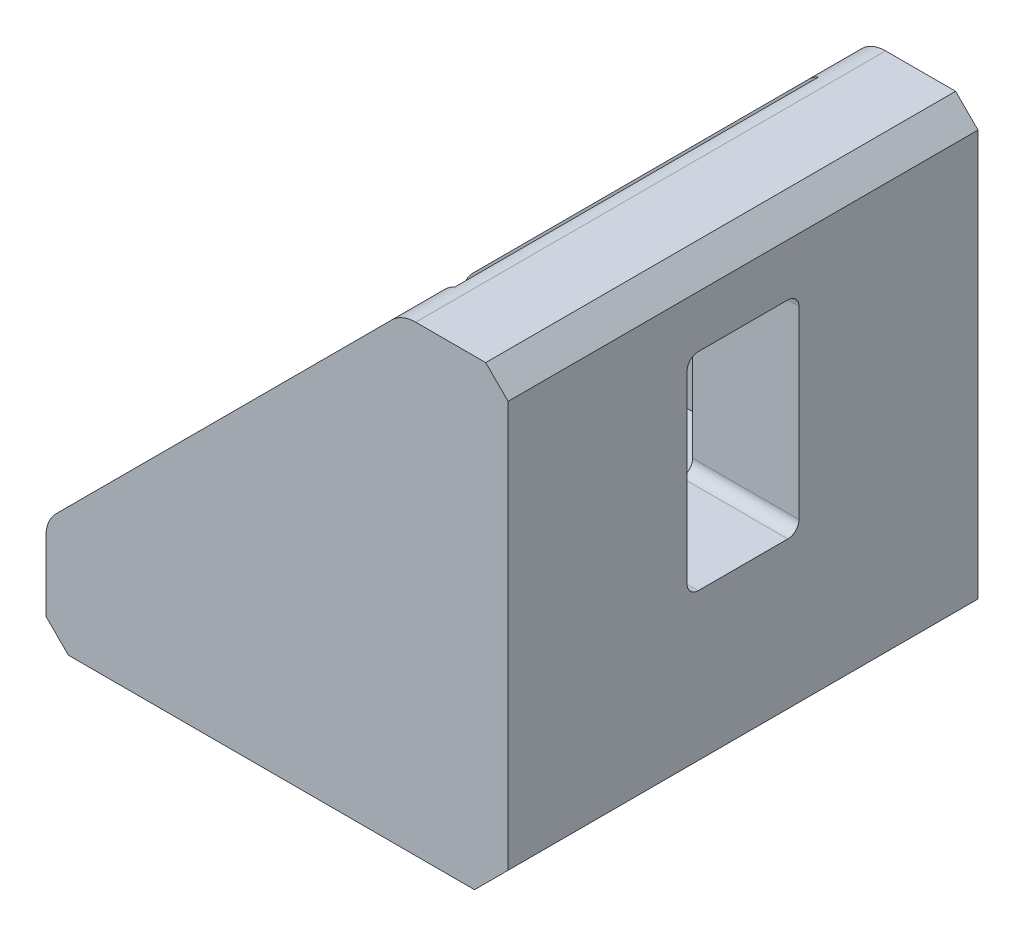
ISO-10303-21;
HEADER;
FILE_DESCRIPTION(('STEP AP214'),'2;1');
FILE_NAME('part.step','',(''),(''),'','','');
FILE_SCHEMA(('AUTOMOTIVE_DESIGN { 1 0 10303 214 1 1 1 1 }'));
ENDSEC;
DATA;
#1=APPLICATION_CONTEXT('core data for automotive mechanical design processes');
#2=APPLICATION_PROTOCOL_DEFINITION('international standard','automotive_design',2000,#1);
#3=PRODUCT_CONTEXT('',#1,'mechanical');
#4=PRODUCT('Part','Part','',(#3));
#5=PRODUCT_RELATED_PRODUCT_CATEGORY('part','',(#4));
#6=PRODUCT_DEFINITION_FORMATION('','',#4);
#7=PRODUCT_DEFINITION_CONTEXT('part definition',#1,'design');
#8=PRODUCT_DEFINITION('design','',#6,#7);
#9=PRODUCT_DEFINITION_SHAPE('','',#8);
#10=(LENGTH_UNIT() NAMED_UNIT(*) SI_UNIT(.MILLI.,.METRE.));
#11=(NAMED_UNIT(*) PLANE_ANGLE_UNIT() SI_UNIT($,.RADIAN.));
#12=(NAMED_UNIT(*) SI_UNIT($,.STERADIAN.) SOLID_ANGLE_UNIT());
#13=UNCERTAINTY_MEASURE_WITH_UNIT(LENGTH_MEASURE(1.E-05),#10,'distance_accuracy_value','');
#14=(GEOMETRIC_REPRESENTATION_CONTEXT(3) GLOBAL_UNCERTAINTY_ASSIGNED_CONTEXT((#13)) GLOBAL_UNIT_ASSIGNED_CONTEXT((#10,
#11,#12)) REPRESENTATION_CONTEXT('',''));
#15=CARTESIAN_POINT('',(0.,0.,0.));
#16=DIRECTION('',(0.,0.,1.));
#17=DIRECTION('',(1.,0.,0.));
#18=AXIS2_PLACEMENT_3D('',#15,#16,#17);
#19=CARTESIAN_POINT('',(-38.3,8.25735931288071,42.));
#20=DIRECTION('',(0.,0.,1.));
#21=DIRECTION('',(1.,0.,0.));
#22=AXIS2_PLACEMENT_3D('',#19,#20,#21);
#23=CYLINDRICAL_SURFACE('',#22,3.);
#24=DIRECTION('',(0.,0.,-1.));
#25=VECTOR('',#24,1.);
#26=CARTESIAN_POINT('',(-41.3,8.25735931288071,42.));
#27=LINE('',#26,#25);
#28=CARTESIAN_POINT('',(-41.3,8.25735931288071,42.));
#29=VERTEX_POINT('',#28);
#30=CARTESIAN_POINT('',(-41.3,8.25735931288071,0.));
#31=VERTEX_POINT('',#30);
#32=EDGE_CURVE('E441',#29,#31,#27,.T.);
#33=ORIENTED_EDGE('',*,*,#32,.F.);
#34=CARTESIAN_POINT('',(-38.3,8.25735931288071,42.));
#35=DIRECTION('',(0.,0.,1.));
#36=DIRECTION('',(1.,0.,0.));
#37=AXIS2_PLACEMENT_3D('',#34,#35,#36);
#38=CIRCLE('',#37,3.);
#39=CARTESIAN_POINT('',(-40.4213203435596,10.3786796564403,42.));
#40=VERTEX_POINT('',#39);
#41=EDGE_CURVE('E462',#40,#29,#38,.T.);
#42=ORIENTED_EDGE('',*,*,#41,.F.);
#43=DIRECTION('',(0.,0.,-1.));
#44=VECTOR('',#43,1.);
#45=CARTESIAN_POINT('',(-40.4213203435596,10.3786796564404,42.));
#46=LINE('',#45,#44);
#47=CARTESIAN_POINT('',(-40.4213203435596,10.3786796564403,37.25));
#48=VERTEX_POINT('',#47);
#49=EDGE_CURVE('E459',#48,#40,#46,.F.);
#50=ORIENTED_EDGE('',*,*,#49,.F.);
#51=CARTESIAN_POINT('',(-38.3,8.25735931288071,37.25));
#52=DIRECTION('',(0.,0.,1.));
#53=DIRECTION('',(1.,0.,0.));
#54=AXIS2_PLACEMENT_3D('',#51,#52,#53);
#55=CIRCLE('',#54,3.);
#56=CARTESIAN_POINT('',(-41.0305391633734,9.49999999999999,37.25));
#57=VERTEX_POINT('',#56);
#58=EDGE_CURVE('E456',#57,#48,#55,.F.);
#59=ORIENTED_EDGE('',*,*,#58,.F.);
#60=DIRECTION('',(0.,0.,1.));
#61=VECTOR('',#60,1.);
#62=CARTESIAN_POINT('',(-41.0305391633734,9.49999999999999,42.));
#63=LINE('',#62,#61);
#64=CARTESIAN_POINT('',(-41.0305391633734,9.49999999999999,4.75));
#65=VERTEX_POINT('',#64);
#66=EDGE_CURVE('E453',#65,#57,#63,.T.);
#67=ORIENTED_EDGE('',*,*,#66,.F.);
#68=CARTESIAN_POINT('',(-38.3,8.25735931288071,4.75));
#69=DIRECTION('',(0.,0.,-1.));
#70=DIRECTION('',(-1.,0.,0.));
#71=AXIS2_PLACEMENT_3D('',#68,#69,#70);
#72=CIRCLE('',#71,3.);
#73=CARTESIAN_POINT('',(-40.4213203435596,10.3786796564404,4.75));
#74=VERTEX_POINT('',#73);
#75=EDGE_CURVE('E450',#74,#65,#72,.F.);
#76=ORIENTED_EDGE('',*,*,#75,.F.);
#77=DIRECTION('',(0.,0.,1.));
#78=VECTOR('',#77,1.);
#79=CARTESIAN_POINT('',(-40.4213203435596,10.3786796564404,42.));
#80=LINE('',#79,#78);
#81=CARTESIAN_POINT('',(-40.4213203435596,10.3786796564404,0.));
#82=VERTEX_POINT('',#81);
#83=EDGE_CURVE('E447',#82,#74,#80,.T.);
#84=ORIENTED_EDGE('',*,*,#83,.F.);
#85=CARTESIAN_POINT('',(-38.3,8.25735931288071,0.));
#86=DIRECTION('',(0.,0.,1.));
#87=DIRECTION('',(1.,0.,0.));
#88=AXIS2_PLACEMENT_3D('',#85,#86,#87);
#89=CIRCLE('',#88,3.);
#90=EDGE_CURVE('E444',#31,#82,#89,.F.);
#91=ORIENTED_EDGE('',*,*,#90,.F.);
#92=EDGE_LOOP('',(#33,#42,#50,#59,#67,#76,#84,#91));
#93=FACE_BOUND('',#92,.T.);
#94=ADVANCED_FACE('F43',(#93),#23,.T.);
#95=CARTESIAN_POINT('',(-8.25735931288072,38.3,42.));
#96=DIRECTION('',(0.,0.,-1.));
#97=DIRECTION('',(-1.,0.,0.));
#98=AXIS2_PLACEMENT_3D('',#95,#96,#97);
#99=CYLINDRICAL_SURFACE('',#98,3.);
#100=DIRECTION('',(0.,0.,1.));
#101=VECTOR('',#100,1.);
#102=CARTESIAN_POINT('',(-8.25735931288072,41.3,42.));
#103=LINE('',#102,#101);
#104=CARTESIAN_POINT('',(-8.25735931288072,41.3,0.));
#105=VERTEX_POINT('',#104);
#106=CARTESIAN_POINT('',(-8.25735931288072,41.3,42.));
#107=VERTEX_POINT('',#106);
#108=EDGE_CURVE('E418',#105,#107,#103,.T.);
#109=ORIENTED_EDGE('',*,*,#108,.F.);
#110=CARTESIAN_POINT('',(-8.25735931288072,38.3,0.));
#111=DIRECTION('',(0.,0.,1.));
#112=DIRECTION('',(1.,0.,0.));
#113=AXIS2_PLACEMENT_3D('',#110,#111,#112);
#114=CIRCLE('',#113,3.);
#115=CARTESIAN_POINT('',(-10.3786796564404,40.4213203435596,0.));
#116=VERTEX_POINT('',#115);
#117=EDGE_CURVE('E436',#116,#105,#114,.F.);
#118=ORIENTED_EDGE('',*,*,#117,.F.);
#119=DIRECTION('',(0.,0.,-1.));
#120=VECTOR('',#119,1.);
#121=CARTESIAN_POINT('',(-10.3786796564404,40.4213203435596,42.));
#122=LINE('',#121,#120);
#123=CARTESIAN_POINT('',(-10.3786796564404,40.4213203435596,4.75));
#124=VERTEX_POINT('',#123);
#125=EDGE_CURVE('E433',#124,#116,#122,.T.);
#126=ORIENTED_EDGE('',*,*,#125,.F.);
#127=CARTESIAN_POINT('',(-8.25735931288072,38.3,4.75));
#128=DIRECTION('',(0.,0.,-1.));
#129=DIRECTION('',(-1.,0.,0.));
#130=AXIS2_PLACEMENT_3D('',#127,#128,#129);
#131=CIRCLE('',#130,3.);
#132=CARTESIAN_POINT('',(-9.5,41.0305391633734,4.75));
#133=VERTEX_POINT('',#132);
#134=EDGE_CURVE('E430',#133,#124,#131,.F.);
#135=ORIENTED_EDGE('',*,*,#134,.F.);
#136=DIRECTION('',(0.,0.,-1.));
#137=VECTOR('',#136,1.);
#138=CARTESIAN_POINT('',(-9.5,41.0305391633734,42.));
#139=LINE('',#138,#137);
#140=CARTESIAN_POINT('',(-9.5,41.0305391633734,37.25));
#141=VERTEX_POINT('',#140);
#142=EDGE_CURVE('E427',#141,#133,#139,.T.);
#143=ORIENTED_EDGE('',*,*,#142,.F.);
#144=CARTESIAN_POINT('',(-8.25735931288072,38.3,37.25));
#145=DIRECTION('',(0.,0.,1.));
#146=DIRECTION('',(1.,0.,0.));
#147=AXIS2_PLACEMENT_3D('',#144,#145,#146);
#148=CIRCLE('',#147,3.);
#149=CARTESIAN_POINT('',(-10.3786796564404,40.4213203435596,37.25));
#150=VERTEX_POINT('',#149);
#151=EDGE_CURVE('E424',#150,#141,#148,.F.);
#152=ORIENTED_EDGE('',*,*,#151,.F.);
#153=DIRECTION('',(0.,0.,1.));
#154=VECTOR('',#153,1.);
#155=CARTESIAN_POINT('',(-10.3786796564404,40.4213203435596,42.));
#156=LINE('',#155,#154);
#157=CARTESIAN_POINT('',(-10.3786796564404,40.4213203435596,42.));
#158=VERTEX_POINT('',#157);
#159=EDGE_CURVE('E421',#158,#150,#156,.F.);
#160=ORIENTED_EDGE('',*,*,#159,.F.);
#161=CARTESIAN_POINT('',(-8.25735931288072,38.3,42.));
#162=DIRECTION('',(0.,0.,1.));
#163=DIRECTION('',(1.,0.,0.));
#164=AXIS2_PLACEMENT_3D('',#161,#162,#163);
#165=CIRCLE('',#164,3.);
#166=EDGE_CURVE('E439',#107,#158,#165,.T.);
#167=ORIENTED_EDGE('',*,*,#166,.F.);
#168=EDGE_LOOP('',(#109,#118,#126,#135,#143,#152,#160,#167));
#169=FACE_BOUND('',#168,.T.);
#170=ADVANCED_FACE('F519',(#169),#99,.T.);
#171=CARTESIAN_POINT('',(-11.5,11.5,42.));
#172=DIRECTION('',(0.,0.,-1.));
#173=DIRECTION('',(-1.,0.,0.));
#174=AXIS2_PLACEMENT_3D('',#171,#172,#173);
#175=CYLINDRICAL_SURFACE('',#174,2.);
#176=DIRECTION('',(0.,0.,1.));
#177=VECTOR('',#176,1.);
#178=CARTESIAN_POINT('',(-9.5,11.5,42.));
#179=LINE('',#178,#177);
#180=CARTESIAN_POINT('',(-9.5,11.5,4.75));
#181=VERTEX_POINT('',#180);
#182=CARTESIAN_POINT('',(-9.5,11.5,37.25));
#183=VERTEX_POINT('',#182);
#184=EDGE_CURVE('E401',#181,#183,#179,.T.);
#185=ORIENTED_EDGE('',*,*,#184,.F.);
#186=CARTESIAN_POINT('',(-11.5,11.5,4.75));
#187=DIRECTION('',(0.,0.,-1.));
#188=DIRECTION('',(-1.,0.,0.));
#189=AXIS2_PLACEMENT_3D('',#186,#187,#188);
#190=CIRCLE('',#189,2.);
#191=CARTESIAN_POINT('',(-11.5,9.49999999999999,4.75));
#192=VERTEX_POINT('',#191);
#193=EDGE_CURVE('E413',#192,#181,#190,.F.);
#194=ORIENTED_EDGE('',*,*,#193,.F.);
#195=DIRECTION('',(0.,0.,1.));
#196=VECTOR('',#195,1.);
#197=CARTESIAN_POINT('',(-11.5,9.49999999999999,42.));
#198=LINE('',#197,#196);
#199=CARTESIAN_POINT('',(-11.5,9.49999999999999,37.25));
#200=VERTEX_POINT('',#199);
#201=EDGE_CURVE('E410',#200,#192,#198,.F.);
#202=ORIENTED_EDGE('',*,*,#201,.F.);
#203=CARTESIAN_POINT('',(-11.5,11.5,37.25));
#204=DIRECTION('',(0.,0.,1.));
#205=DIRECTION('',(1.,0.,0.));
#206=AXIS2_PLACEMENT_3D('',#203,#204,#205);
#207=CIRCLE('',#206,2.);
#208=EDGE_CURVE('E415',#183,#200,#207,.F.);
#209=ORIENTED_EDGE('',*,*,#208,.F.);
#210=EDGE_LOOP('',(#185,#194,#202,#209));
#211=FACE_BOUND('',#210,.T.);
#212=ADVANCED_FACE('F553',(#211),#175,.F.);
#213=CARTESIAN_POINT('',(-9.5,9.49999999999999,42.));
#214=DIRECTION('',(1.,0.,0.));
#215=DIRECTION('',(0.,0.,-1.));
#216=AXIS2_PLACEMENT_3D('',#213,#214,#215);
#217=PLANE('',#216);
#218=DIRECTION('',(0.,1.,0.));
#219=VECTOR('',#218,1.);
#220=CARTESIAN_POINT('',(-9.5,17.15,26.));
#221=LINE('',#220,#219);
#222=CARTESIAN_POINT('',(-9.5,17.15,26.));
#223=VERTEX_POINT('',#222);
#224=CARTESIAN_POINT('',(-9.5,33.65,26.));
#225=VERTEX_POINT('',#224);
#226=EDGE_CURVE('E331',#223,#225,#221,.T.);
#227=ORIENTED_EDGE('',*,*,#226,.F.);
#228=CARTESIAN_POINT('',(-9.5,17.15,25.));
#229=DIRECTION('',(-1.,0.,0.));
#230=DIRECTION('',(0.,0.,-1.));
#231=AXIS2_PLACEMENT_3D('',#228,#229,#230);
#232=CIRCLE('',#231,1.);
#233=CARTESIAN_POINT('',(-9.5,16.15,25.));
#234=VERTEX_POINT('',#233);
#235=EDGE_CURVE('E311',#234,#223,#232,.T.);
#236=ORIENTED_EDGE('',*,*,#235,.F.);
#237=DIRECTION('',(0.,0.,1.));
#238=VECTOR('',#237,1.);
#239=CARTESIAN_POINT('',(-9.5,16.15,17.));
#240=LINE('',#239,#238);
#241=CARTESIAN_POINT('',(-9.5,16.15,17.));
#242=VERTEX_POINT('',#241);
#243=EDGE_CURVE('E349',#242,#234,#240,.T.);
#244=ORIENTED_EDGE('',*,*,#243,.F.);
#245=CARTESIAN_POINT('',(-9.5,17.15,17.));
#246=DIRECTION('',(-1.,0.,0.));
#247=DIRECTION('',(0.,0.,-1.));
#248=AXIS2_PLACEMENT_3D('',#245,#246,#247);
#249=CIRCLE('',#248,1.);
#250=CARTESIAN_POINT('',(-9.5,17.15,16.));
#251=VERTEX_POINT('',#250);
#252=EDGE_CURVE('E346',#251,#242,#249,.T.);
#253=ORIENTED_EDGE('',*,*,#252,.F.);
#254=DIRECTION('',(0.,-1.,0.));
#255=VECTOR('',#254,1.);
#256=CARTESIAN_POINT('',(-9.5,17.15,16.));
#257=LINE('',#256,#255);
#258=CARTESIAN_POINT('',(-9.5,33.65,16.));
#259=VERTEX_POINT('',#258);
#260=EDGE_CURVE('E343',#259,#251,#257,.T.);
#261=ORIENTED_EDGE('',*,*,#260,.F.);
#262=CARTESIAN_POINT('',(-9.5,33.65,17.));
#263=DIRECTION('',(-1.,0.,0.));
#264=DIRECTION('',(0.,0.,1.));
#265=AXIS2_PLACEMENT_3D('',#262,#263,#264);
#266=CIRCLE('',#265,1.);
#267=CARTESIAN_POINT('',(-9.5,34.65,17.));
#268=VERTEX_POINT('',#267);
#269=EDGE_CURVE('E340',#268,#259,#266,.T.);
#270=ORIENTED_EDGE('',*,*,#269,.F.);
#271=DIRECTION('',(0.,0.,-1.));
#272=VECTOR('',#271,1.);
#273=CARTESIAN_POINT('',(-9.5,34.65,17.));
#274=LINE('',#273,#272);
#275=CARTESIAN_POINT('',(-9.5,34.65,25.));
#276=VERTEX_POINT('',#275);
#277=EDGE_CURVE('E337',#276,#268,#274,.T.);
#278=ORIENTED_EDGE('',*,*,#277,.F.);
#279=CARTESIAN_POINT('',(-9.5,33.65,25.));
#280=DIRECTION('',(-1.,0.,0.));
#281=DIRECTION('',(0.,0.,1.));
#282=AXIS2_PLACEMENT_3D('',#279,#280,#281);
#283=CIRCLE('',#282,1.);
#284=EDGE_CURVE('E334',#225,#276,#283,.T.);
#285=ORIENTED_EDGE('',*,*,#284,.F.);
#286=EDGE_LOOP('',(#227,#236,#244,#253,#261,#270,#278,#285));
#287=FACE_BOUND('',#286,.T.);
#288=DIRECTION('',(0.,1.,0.));
#289=VECTOR('',#288,1.);
#290=CARTESIAN_POINT('',(-9.5,41.3,37.25));
#291=LINE('',#290,#289);
#292=EDGE_CURVE('E383',#183,#141,#291,.T.);
#293=ORIENTED_EDGE('',*,*,#292,.T.);
#294=ORIENTED_EDGE('',*,*,#142,.T.);
#295=DIRECTION('',(0.,1.,0.));
#296=VECTOR('',#295,1.);
#297=CARTESIAN_POINT('',(-9.5,41.3,4.75));
#298=LINE('',#297,#296);
#299=EDGE_CURVE('E375',#181,#133,#298,.T.);
#300=ORIENTED_EDGE('',*,*,#299,.F.);
#301=ORIENTED_EDGE('',*,*,#184,.T.);
#302=EDGE_LOOP('',(#293,#294,#300,#301));
#303=FACE_BOUND('',#302,.T.);
#304=ADVANCED_FACE('F634',(#287,#303),#217,.F.);
#305=CARTESIAN_POINT('',(-41.3,9.49999999999999,42.));
#306=DIRECTION('',(0.,-1.,0.));
#307=DIRECTION('',(0.,0.,-1.));
#308=AXIS2_PLACEMENT_3D('',#305,#306,#307);
#309=PLANE('',#308);
#310=DIRECTION('',(0.,0.,-1.));
#311=VECTOR('',#310,1.);
#312=CARTESIAN_POINT('',(-16.15,9.49999999999999,25.));
#313=LINE('',#312,#311);
#314=CARTESIAN_POINT('',(-16.15,9.49999999999999,25.));
#315=VERTEX_POINT('',#314);
#316=CARTESIAN_POINT('',(-16.15,9.49999999999999,17.));
#317=VERTEX_POINT('',#316);
#318=EDGE_CURVE('E269',#315,#317,#313,.T.);
#319=ORIENTED_EDGE('',*,*,#318,.F.);
#320=CARTESIAN_POINT('',(-17.15,9.49999999999999,25.));
#321=DIRECTION('',(0.,1.,0.));
#322=DIRECTION('',(0.,0.,1.));
#323=AXIS2_PLACEMENT_3D('',#320,#321,#322);
#324=CIRCLE('',#323,1.);
#325=CARTESIAN_POINT('',(-17.15,9.49999999999999,26.));
#326=VERTEX_POINT('',#325);
#327=EDGE_CURVE('E274',#326,#315,#324,.T.);
#328=ORIENTED_EDGE('',*,*,#327,.F.);
#329=DIRECTION('',(1.,0.,0.));
#330=VECTOR('',#329,1.);
#331=CARTESIAN_POINT('',(-33.65,9.49999999999999,26.));
#332=LINE('',#331,#330);
#333=CARTESIAN_POINT('',(-33.65,9.49999999999999,26.));
#334=VERTEX_POINT('',#333);
#335=EDGE_CURVE('E294',#334,#326,#332,.T.);
#336=ORIENTED_EDGE('',*,*,#335,.F.);
#337=CARTESIAN_POINT('',(-33.65,9.49999999999999,25.));
#338=DIRECTION('',(0.,1.,0.));
#339=DIRECTION('',(0.,0.,-1.));
#340=AXIS2_PLACEMENT_3D('',#337,#338,#339);
#341=CIRCLE('',#340,1.);
#342=CARTESIAN_POINT('',(-34.65,9.49999999999999,25.));
#343=VERTEX_POINT('',#342);
#344=EDGE_CURVE('E291',#343,#334,#341,.T.);
#345=ORIENTED_EDGE('',*,*,#344,.F.);
#346=DIRECTION('',(0.,0.,1.));
#347=VECTOR('',#346,1.);
#348=CARTESIAN_POINT('',(-34.65,9.49999999999999,25.));
#349=LINE('',#348,#347);
#350=CARTESIAN_POINT('',(-34.65,9.49999999999999,17.));
#351=VERTEX_POINT('',#350);
#352=EDGE_CURVE('E288',#351,#343,#349,.T.);
#353=ORIENTED_EDGE('',*,*,#352,.F.);
#354=CARTESIAN_POINT('',(-33.65,9.49999999999999,17.));
#355=DIRECTION('',(0.,1.,0.));
#356=DIRECTION('',(0.,0.,1.));
#357=AXIS2_PLACEMENT_3D('',#354,#355,#356);
#358=CIRCLE('',#357,1.);
#359=CARTESIAN_POINT('',(-33.65,9.49999999999999,16.));
#360=VERTEX_POINT('',#359);
#361=EDGE_CURVE('E282',#360,#351,#358,.T.);
#362=ORIENTED_EDGE('',*,*,#361,.F.);
#363=DIRECTION('',(-1.,0.,0.));
#364=VECTOR('',#363,1.);
#365=CARTESIAN_POINT('',(-33.65,9.49999999999999,16.));
#366=LINE('',#365,#364);
#367=CARTESIAN_POINT('',(-17.15,9.49999999999999,16.));
#368=VERTEX_POINT('',#367);
#369=EDGE_CURVE('E280',#368,#360,#366,.T.);
#370=ORIENTED_EDGE('',*,*,#369,.F.);
#371=CARTESIAN_POINT('',(-17.15,9.49999999999999,17.));
#372=DIRECTION('',(0.,1.,0.));
#373=DIRECTION('',(0.,0.,1.));
#374=AXIS2_PLACEMENT_3D('',#371,#372,#373);
#375=CIRCLE('',#374,1.);
#376=EDGE_CURVE('E258',#317,#368,#375,.T.);
#377=ORIENTED_EDGE('',*,*,#376,.F.);
#378=EDGE_LOOP('',(#319,#328,#336,#345,#353,#362,#370,#377));
#379=FACE_BOUND('',#378,.T.);
#380=DIRECTION('',(1.,0.,0.));
#381=VECTOR('',#380,1.);
#382=CARTESIAN_POINT('',(-9.5,9.49999999999999,4.75));
#383=LINE('',#382,#381);
#384=EDGE_CURVE('E370',#65,#192,#383,.T.);
#385=ORIENTED_EDGE('',*,*,#384,.F.);
#386=ORIENTED_EDGE('',*,*,#66,.T.);
#387=DIRECTION('',(1.,0.,0.));
#388=VECTOR('',#387,1.);
#389=CARTESIAN_POINT('',(-9.5,9.49999999999999,37.25));
#390=LINE('',#389,#388);
#391=EDGE_CURVE('E381',#57,#200,#390,.T.);
#392=ORIENTED_EDGE('',*,*,#391,.T.);
#393=ORIENTED_EDGE('',*,*,#201,.T.);
#394=EDGE_LOOP('',(#385,#386,#392,#393));
#395=FACE_BOUND('',#394,.T.);
#396=ADVANCED_FACE('F276',(#379,#395),#309,.F.);
#397=CARTESIAN_POINT('',(0.,0.,42.));
#398=DIRECTION('',(-1.,0.,0.));
#399=DIRECTION('',(0.,0.,1.));
#400=AXIS2_PLACEMENT_3D('',#397,#398,#399);
#401=PLANE('',#400);
#402=DIRECTION('',(0.,0.,-1.));
#403=VECTOR('',#402,1.);
#404=CARTESIAN_POINT('',(0.,16.15,17.));
#405=LINE('',#404,#403);
#406=CARTESIAN_POINT('',(0.,16.15,25.));
#407=VERTEX_POINT('',#406);
#408=CARTESIAN_POINT('',(0.,16.15,17.));
#409=VERTEX_POINT('',#408);
#410=EDGE_CURVE('E325',#407,#409,#405,.T.);
#411=ORIENTED_EDGE('',*,*,#410,.F.);
#412=CARTESIAN_POINT('',(0.,17.15,25.));
#413=DIRECTION('',(-1.,0.,0.));
#414=DIRECTION('',(0.,0.,1.));
#415=AXIS2_PLACEMENT_3D('',#412,#413,#414);
#416=CIRCLE('',#415,1.);
#417=CARTESIAN_POINT('',(0.,17.15,26.));
#418=VERTEX_POINT('',#417);
#419=EDGE_CURVE('E327',#418,#407,#416,.F.);
#420=ORIENTED_EDGE('',*,*,#419,.F.);
#421=DIRECTION('',(0.,-1.,0.));
#422=VECTOR('',#421,1.);
#423=CARTESIAN_POINT('',(0.,17.15,26.));
#424=LINE('',#423,#422);
#425=CARTESIAN_POINT('',(0.,33.65,26.));
#426=VERTEX_POINT('',#425);
#427=EDGE_CURVE('E329',#426,#418,#424,.T.);
#428=ORIENTED_EDGE('',*,*,#427,.F.);
#429=CARTESIAN_POINT('',(0.,33.65,25.));
#430=DIRECTION('',(-1.,0.,0.));
#431=DIRECTION('',(0.,0.,1.));
#432=AXIS2_PLACEMENT_3D('',#429,#430,#431);
#433=CIRCLE('',#432,1.);
#434=CARTESIAN_POINT('',(0.,34.65,25.));
#435=VERTEX_POINT('',#434);
#436=EDGE_CURVE('E313',#435,#426,#433,.F.);
#437=ORIENTED_EDGE('',*,*,#436,.F.);
#438=DIRECTION('',(0.,0.,1.));
#439=VECTOR('',#438,1.);
#440=CARTESIAN_POINT('',(0.,34.65,17.));
#441=LINE('',#440,#439);
#442=CARTESIAN_POINT('',(0.,34.65,17.));
#443=VERTEX_POINT('',#442);
#444=EDGE_CURVE('E316',#443,#435,#441,.T.);
#445=ORIENTED_EDGE('',*,*,#444,.F.);
#446=CARTESIAN_POINT('',(0.,33.65,17.));
#447=DIRECTION('',(-1.,0.,0.));
#448=DIRECTION('',(0.,0.,1.));
#449=AXIS2_PLACEMENT_3D('',#446,#447,#448);
#450=CIRCLE('',#449,1.);
#451=CARTESIAN_POINT('',(0.,33.65,16.));
#452=VERTEX_POINT('',#451);
#453=EDGE_CURVE('E319',#452,#443,#450,.F.);
#454=ORIENTED_EDGE('',*,*,#453,.F.);
#455=DIRECTION('',(0.,1.,0.));
#456=VECTOR('',#455,1.);
#457=CARTESIAN_POINT('',(0.,17.15,16.));
#458=LINE('',#457,#456);
#459=CARTESIAN_POINT('',(0.,17.15,16.));
#460=VERTEX_POINT('',#459);
#461=EDGE_CURVE('E321',#460,#452,#458,.T.);
#462=ORIENTED_EDGE('',*,*,#461,.F.);
#463=CARTESIAN_POINT('',(0.,17.15,17.));
#464=DIRECTION('',(-1.,0.,0.));
#465=DIRECTION('',(0.,0.,1.));
#466=AXIS2_PLACEMENT_3D('',#463,#464,#465);
#467=CIRCLE('',#466,1.);
#468=EDGE_CURVE('E323',#409,#460,#467,.F.);
#469=ORIENTED_EDGE('',*,*,#468,.F.);
#470=EDGE_LOOP('',(#411,#420,#428,#437,#445,#454,#462,#469));
#471=FACE_BOUND('',#470,.T.);
#472=DIRECTION('',(0.,1.,0.));
#473=VECTOR('',#472,1.);
#474=CARTESIAN_POINT('',(0.,0.,42.));
#475=LINE('',#474,#473);
#476=CARTESIAN_POINT('',(0.,2.99999999999999,42.));
#477=VERTEX_POINT('',#476);
#478=CARTESIAN_POINT('',(0.,39.3,42.));
#479=VERTEX_POINT('',#478);
#480=EDGE_CURVE('E392',#477,#479,#475,.T.);
#481=ORIENTED_EDGE('',*,*,#480,.F.);
#482=DIRECTION('',(0.,0.,-1.));
#483=VECTOR('',#482,1.);
#484=CARTESIAN_POINT('',(0.,2.99999999999999,42.));
#485=LINE('',#484,#483);
#486=CARTESIAN_POINT('',(0.,2.99999999999999,0.));
#487=VERTEX_POINT('',#486);
#488=EDGE_CURVE('E475',#477,#487,#485,.T.);
#489=ORIENTED_EDGE('',*,*,#488,.T.);
#490=DIRECTION('',(0.,1.,0.));
#491=VECTOR('',#490,1.);
#492=CARTESIAN_POINT('',(0.,0.,0.));
#493=LINE('',#492,#491);
#494=CARTESIAN_POINT('',(0.,39.3,0.));
#495=VERTEX_POINT('',#494);
#496=EDGE_CURVE('E389',#487,#495,#493,.T.);
#497=ORIENTED_EDGE('',*,*,#496,.T.);
#498=DIRECTION('',(0.,0.,1.));
#499=VECTOR('',#498,1.);
#500=CARTESIAN_POINT('',(0.,39.3,42.));
#501=LINE('',#500,#499);
#502=EDGE_CURVE('E470',#495,#479,#501,.T.);
#503=ORIENTED_EDGE('',*,*,#502,.T.);
#504=EDGE_LOOP('',(#481,#489,#497,#503));
#505=FACE_BOUND('',#504,.T.);
#506=ADVANCED_FACE('F506',(#471,#505),#401,.F.);
#507=CARTESIAN_POINT('',(0.,41.3,42.));
#508=DIRECTION('',(0.,-1.,0.));
#509=DIRECTION('',(0.,0.,-1.));
#510=AXIS2_PLACEMENT_3D('',#507,#508,#509);
#511=PLANE('',#510);
#512=DIRECTION('',(-1.,0.,0.));
#513=VECTOR('',#512,1.);
#514=CARTESIAN_POINT('',(0.,41.3,42.));
#515=LINE('',#514,#513);
#516=CARTESIAN_POINT('',(-2.00000000000001,41.3,42.));
#517=VERTEX_POINT('',#516);
#518=EDGE_CURVE('E394',#517,#107,#515,.T.);
#519=ORIENTED_EDGE('',*,*,#518,.F.);
#520=DIRECTION('',(0.,0.,-1.));
#521=VECTOR('',#520,1.);
#522=CARTESIAN_POINT('',(-2.00000000000001,41.3,42.));
#523=LINE('',#522,#521);
#524=CARTESIAN_POINT('',(-2.00000000000001,41.3,0.));
#525=VERTEX_POINT('',#524);
#526=EDGE_CURVE('E464',#517,#525,#523,.T.);
#527=ORIENTED_EDGE('',*,*,#526,.T.);
#528=DIRECTION('',(-1.,0.,0.));
#529=VECTOR('',#528,1.);
#530=CARTESIAN_POINT('',(0.,41.3,0.));
#531=LINE('',#530,#529);
#532=EDGE_CURVE('E403',#525,#105,#531,.T.);
#533=ORIENTED_EDGE('',*,*,#532,.T.);
#534=ORIENTED_EDGE('',*,*,#108,.T.);
#535=EDGE_LOOP('',(#519,#527,#533,#534));
#536=FACE_BOUND('',#535,.T.);
#537=ADVANCED_FACE('F515',(#536),#511,.F.);
#538=CARTESIAN_POINT('',(-41.3,0.,42.));
#539=DIRECTION('',(1.,0.,0.));
#540=DIRECTION('',(0.,0.,-1.));
#541=AXIS2_PLACEMENT_3D('',#538,#539,#540);
#542=PLANE('',#541);
#543=DIRECTION('',(0.,-1.,0.));
#544=VECTOR('',#543,1.);
#545=CARTESIAN_POINT('',(-41.3,0.,0.));
#546=LINE('',#545,#544);
#547=CARTESIAN_POINT('',(-41.3,2.00000000000001,0.));
#548=VERTEX_POINT('',#547);
#549=EDGE_CURVE('E405',#31,#548,#546,.T.);
#550=ORIENTED_EDGE('',*,*,#549,.T.);
#551=DIRECTION('',(0.,0.,1.));
#552=VECTOR('',#551,1.);
#553=CARTESIAN_POINT('',(-41.3,2.00000000000001,42.));
#554=LINE('',#553,#552);
#555=CARTESIAN_POINT('',(-41.3,2.00000000000001,42.));
#556=VERTEX_POINT('',#555);
#557=EDGE_CURVE('E52',#548,#556,#554,.T.);
#558=ORIENTED_EDGE('',*,*,#557,.T.);
#559=DIRECTION('',(0.,-1.,0.));
#560=VECTOR('',#559,1.);
#561=CARTESIAN_POINT('',(-41.3,0.,42.));
#562=LINE('',#561,#560);
#563=EDGE_CURVE('E397',#29,#556,#562,.T.);
#564=ORIENTED_EDGE('',*,*,#563,.F.);
#565=ORIENTED_EDGE('',*,*,#32,.T.);
#566=EDGE_LOOP('',(#550,#558,#564,#565));
#567=FACE_BOUND('',#566,.T.);
#568=ADVANCED_FACE('F540',(#567),#542,.F.);
#569=CARTESIAN_POINT('',(0.,0.,42.));
#570=DIRECTION('',(0.,1.,0.));
#571=DIRECTION('',(-1.,0.,0.));
#572=AXIS2_PLACEMENT_3D('',#569,#570,#571);
#573=PLANE('',#572);
#574=DIRECTION('',(-1.,0.,0.));
#575=VECTOR('',#574,1.);
#576=CARTESIAN_POINT('',(-33.65,0.,26.));
#577=LINE('',#576,#575);
#578=CARTESIAN_POINT('',(-17.15,0.,26.));
#579=VERTEX_POINT('',#578);
#580=CARTESIAN_POINT('',(-33.65,0.,26.));
#581=VERTEX_POINT('',#580);
#582=EDGE_CURVE('E877',#579,#581,#577,.T.);
#583=ORIENTED_EDGE('',*,*,#582,.F.);
#584=CARTESIAN_POINT('',(-17.15,0.,25.));
#585=DIRECTION('',(0.,1.,0.));
#586=DIRECTION('',(-1.,0.,0.));
#587=AXIS2_PLACEMENT_3D('',#584,#585,#586);
#588=CIRCLE('',#587,1.);
#589=CARTESIAN_POINT('',(-16.15,0.,25.));
#590=VERTEX_POINT('',#589);
#591=EDGE_CURVE('E312',#590,#579,#588,.F.);
#592=ORIENTED_EDGE('',*,*,#591,.F.);
#593=DIRECTION('',(0.,0.,1.));
#594=VECTOR('',#593,1.);
#595=CARTESIAN_POINT('',(-16.15,0.,25.));
#596=LINE('',#595,#594);
#597=CARTESIAN_POINT('',(-16.15,0.,17.));
#598=VERTEX_POINT('',#597);
#599=EDGE_CURVE('E309',#598,#590,#596,.T.);
#600=ORIENTED_EDGE('',*,*,#599,.F.);
#601=CARTESIAN_POINT('',(-17.15,0.,17.));
#602=DIRECTION('',(0.,1.,0.));
#603=DIRECTION('',(-1.,0.,0.));
#604=AXIS2_PLACEMENT_3D('',#601,#602,#603);
#605=CIRCLE('',#604,1.);
#606=CARTESIAN_POINT('',(-17.15,0.,16.));
#607=VERTEX_POINT('',#606);
#608=EDGE_CURVE('E261',#607,#598,#605,.F.);
#609=ORIENTED_EDGE('',*,*,#608,.F.);
#610=DIRECTION('',(1.,0.,0.));
#611=VECTOR('',#610,1.);
#612=CARTESIAN_POINT('',(-33.65,0.,16.));
#613=LINE('',#612,#611);
#614=CARTESIAN_POINT('',(-33.65,0.,16.));
#615=VERTEX_POINT('',#614);
#616=EDGE_CURVE('E864',#615,#607,#613,.T.);
#617=ORIENTED_EDGE('',*,*,#616,.F.);
#618=CARTESIAN_POINT('',(-33.65,0.,17.));
#619=DIRECTION('',(0.,1.,0.));
#620=DIRECTION('',(-1.,0.,0.));
#621=AXIS2_PLACEMENT_3D('',#618,#619,#620);
#622=CIRCLE('',#621,1.);
#623=CARTESIAN_POINT('',(-34.65,0.,17.));
#624=VERTEX_POINT('',#623);
#625=EDGE_CURVE('E866',#624,#615,#622,.F.);
#626=ORIENTED_EDGE('',*,*,#625,.F.);
#627=DIRECTION('',(0.,0.,-1.));
#628=VECTOR('',#627,1.);
#629=CARTESIAN_POINT('',(-34.65,0.,25.));
#630=LINE('',#629,#628);
#631=CARTESIAN_POINT('',(-34.65,0.,25.));
#632=VERTEX_POINT('',#631);
#633=EDGE_CURVE('E873',#632,#624,#630,.T.);
#634=ORIENTED_EDGE('',*,*,#633,.F.);
#635=CARTESIAN_POINT('',(-33.65,0.,25.));
#636=DIRECTION('',(0.,1.,0.));
#637=DIRECTION('',(-1.,0.,0.));
#638=AXIS2_PLACEMENT_3D('',#635,#636,#637);
#639=CIRCLE('',#638,1.);
#640=EDGE_CURVE('E875',#581,#632,#639,.F.);
#641=ORIENTED_EDGE('',*,*,#640,.F.);
#642=EDGE_LOOP('',(#583,#592,#600,#609,#617,#626,#634,#641));
#643=FACE_BOUND('',#642,.T.);
#644=DIRECTION('',(1.,0.,0.));
#645=VECTOR('',#644,1.);
#646=CARTESIAN_POINT('',(0.,0.,42.));
#647=LINE('',#646,#645);
#648=CARTESIAN_POINT('',(-39.3,0.,42.));
#649=VERTEX_POINT('',#648);
#650=CARTESIAN_POINT('',(-3.,0.,42.));
#651=VERTEX_POINT('',#650);
#652=EDGE_CURVE('E399',#649,#651,#647,.T.);
#653=ORIENTED_EDGE('',*,*,#652,.F.);
#654=DIRECTION('',(0.,0.,-1.));
#655=VECTOR('',#654,1.);
#656=CARTESIAN_POINT('',(-39.3,0.,42.));
#657=LINE('',#656,#655);
#658=CARTESIAN_POINT('',(-39.3,0.,0.));
#659=VERTEX_POINT('',#658);
#660=EDGE_CURVE('E486',#649,#659,#657,.T.);
#661=ORIENTED_EDGE('',*,*,#660,.T.);
#662=DIRECTION('',(1.,0.,0.));
#663=VECTOR('',#662,1.);
#664=CARTESIAN_POINT('',(0.,0.,0.));
#665=LINE('',#664,#663);
#666=CARTESIAN_POINT('',(-3.,0.,0.));
#667=VERTEX_POINT('',#666);
#668=EDGE_CURVE('E395',#659,#667,#665,.T.);
#669=ORIENTED_EDGE('',*,*,#668,.T.);
#670=DIRECTION('',(0.,0.,1.));
#671=VECTOR('',#670,1.);
#672=CARTESIAN_POINT('',(-3.,0.,42.));
#673=LINE('',#672,#671);
#674=EDGE_CURVE('E481',#667,#651,#673,.T.);
#675=ORIENTED_EDGE('',*,*,#674,.T.);
#676=EDGE_LOOP('',(#653,#661,#669,#675));
#677=FACE_BOUND('',#676,.T.);
#678=ADVANCED_FACE('F492',(#643,#677),#573,.F.);
#679=CARTESIAN_POINT('',(0.,0.,42.));
#680=DIRECTION('',(0.,0.,1.));
#681=DIRECTION('',(1.,0.,0.));
#682=AXIS2_PLACEMENT_3D('',#679,#680,#681);
#683=PLANE('',#682);
#684=ORIENTED_EDGE('',*,*,#563,.T.);
#685=DIRECTION('',(-0.707106781186546,0.707106781186549,0.));
#686=VECTOR('',#685,1.);
#687=CARTESIAN_POINT('',(-19.6500000000001,-19.65,42.));
#688=LINE('',#687,#686);
#689=EDGE_CURVE('E11',#556,#649,#688,.F.);
#690=ORIENTED_EDGE('',*,*,#689,.T.);
#691=ORIENTED_EDGE('',*,*,#652,.T.);
#692=DIRECTION('',(-0.707106781186549,-0.707106781186546,0.));
#693=VECTOR('',#692,1.);
#694=CARTESIAN_POINT('',(-1.49999999999999,1.5,42.));
#695=LINE('',#694,#693);
#696=EDGE_CURVE('E484',#651,#477,#695,.F.);
#697=ORIENTED_EDGE('',*,*,#696,.T.);
#698=ORIENTED_EDGE('',*,*,#480,.T.);
#699=DIRECTION('',(0.707106781186546,-0.707106781186549,0.));
#700=VECTOR('',#699,1.);
#701=CARTESIAN_POINT('',(19.65,19.6499999999999,42.));
#702=LINE('',#701,#700);
#703=EDGE_CURVE('E473',#479,#517,#702,.F.);
#704=ORIENTED_EDGE('',*,*,#703,.T.);
#705=ORIENTED_EDGE('',*,*,#518,.T.);
#706=ORIENTED_EDGE('',*,*,#166,.T.);
#707=DIRECTION('',(-0.707106781186547,-0.707106781186548,0.));
#708=VECTOR('',#707,1.);
#709=CARTESIAN_POINT('',(-41.3,9.49999999999999,42.));
#710=LINE('',#709,#708);
#711=EDGE_CURVE('E378',#158,#40,#710,.T.);
#712=ORIENTED_EDGE('',*,*,#711,.T.);
#713=ORIENTED_EDGE('',*,*,#41,.T.);
#714=EDGE_LOOP('',(#684,#690,#691,#697,#698,#704,#705,#706,#712,#713));
#715=FACE_BOUND('',#714,.T.);
#716=ADVANCED_FACE('F504',(#715),#683,.T.);
#717=CARTESIAN_POINT('',(0.,0.,0.));
#718=DIRECTION('',(0.,0.,1.));
#719=DIRECTION('',(1.,0.,0.));
#720=AXIS2_PLACEMENT_3D('',#717,#718,#719);
#721=PLANE('',#720);
#722=ORIENTED_EDGE('',*,*,#668,.F.);
#723=DIRECTION('',(0.707106781186546,-0.707106781186549,0.));
#724=VECTOR('',#723,1.);
#725=CARTESIAN_POINT('',(-39.3,0.,0.));
#726=LINE('',#725,#724);
#727=EDGE_CURVE('E66',#659,#548,#726,.F.);
#728=ORIENTED_EDGE('',*,*,#727,.T.);
#729=ORIENTED_EDGE('',*,*,#549,.F.);
#730=ORIENTED_EDGE('',*,*,#90,.T.);
#731=DIRECTION('',(-0.707106781186547,-0.707106781186548,0.));
#732=VECTOR('',#731,1.);
#733=CARTESIAN_POINT('',(-41.3,9.49999999999999,0.));
#734=LINE('',#733,#732);
#735=EDGE_CURVE('E369',#116,#82,#734,.T.);
#736=ORIENTED_EDGE('',*,*,#735,.F.);
#737=ORIENTED_EDGE('',*,*,#117,.T.);
#738=ORIENTED_EDGE('',*,*,#532,.F.);
#739=DIRECTION('',(-0.707106781186546,0.707106781186549,0.));
#740=VECTOR('',#739,1.);
#741=CARTESIAN_POINT('',(-2.00000000000001,41.3,0.));
#742=LINE('',#741,#740);
#743=EDGE_CURVE('E467',#525,#495,#742,.F.);
#744=ORIENTED_EDGE('',*,*,#743,.T.);
#745=ORIENTED_EDGE('',*,*,#496,.F.);
#746=DIRECTION('',(0.707106781186549,0.707106781186546,0.));
#747=VECTOR('',#746,1.);
#748=CARTESIAN_POINT('',(0.,2.99999999999999,0.));
#749=LINE('',#748,#747);
#750=EDGE_CURVE('E478',#487,#667,#749,.F.);
#751=ORIENTED_EDGE('',*,*,#750,.T.);
#752=EDGE_LOOP('',(#722,#728,#729,#730,#736,#737,#738,#744,#745,#751));
#753=FACE_BOUND('',#752,.T.);
#754=ADVANCED_FACE('F495',(#753),#721,.F.);
#755=CARTESIAN_POINT('',(-41.3,9.49999999999999,37.25));
#756=DIRECTION('',(-0.707106781186548,0.707106781186547,0.));
#757=DIRECTION('',(-0.707106781186547,-0.707106781186548,0.));
#758=AXIS2_PLACEMENT_3D('',#755,#756,#757);
#759=PLANE('',#758);
#760=DIRECTION('',(-0.707106781186547,-0.707106781186548,0.));
#761=VECTOR('',#760,1.);
#762=CARTESIAN_POINT('',(-41.3,9.49999999999999,37.25));
#763=LINE('',#762,#761);
#764=EDGE_CURVE('E386',#150,#48,#763,.T.);
#765=ORIENTED_EDGE('',*,*,#764,.T.);
#766=ORIENTED_EDGE('',*,*,#49,.T.);
#767=ORIENTED_EDGE('',*,*,#711,.F.);
#768=ORIENTED_EDGE('',*,*,#159,.T.);
#769=EDGE_LOOP('',(#765,#766,#767,#768));
#770=FACE_BOUND('',#769,.T.);
#771=ADVANCED_FACE('F524',(#770),#759,.T.);
#772=CARTESIAN_POINT('',(0.,0.,37.25));
#773=DIRECTION('',(0.,0.,1.));
#774=DIRECTION('',(1.,0.,0.));
#775=AXIS2_PLACEMENT_3D('',#772,#773,#774);
#776=PLANE('',#775);
#777=ORIENTED_EDGE('',*,*,#391,.F.);
#778=ORIENTED_EDGE('',*,*,#58,.T.);
#779=ORIENTED_EDGE('',*,*,#764,.F.);
#780=ORIENTED_EDGE('',*,*,#151,.T.);
#781=ORIENTED_EDGE('',*,*,#292,.F.);
#782=ORIENTED_EDGE('',*,*,#208,.T.);
#783=EDGE_LOOP('',(#777,#778,#779,#780,#781,#782));
#784=FACE_BOUND('',#783,.T.);
#785=ADVANCED_FACE('F529',(#784),#776,.F.);
#786=CARTESIAN_POINT('',(-41.3,9.49999999999999,4.75));
#787=DIRECTION('',(0.707106781186548,-0.707106781186547,0.));
#788=DIRECTION('',(0.707106781186547,0.707106781186548,0.));
#789=AXIS2_PLACEMENT_3D('',#786,#787,#788);
#790=PLANE('',#789);
#791=ORIENTED_EDGE('',*,*,#735,.T.);
#792=ORIENTED_EDGE('',*,*,#83,.T.);
#793=DIRECTION('',(-0.707106781186547,-0.707106781186548,0.));
#794=VECTOR('',#793,1.);
#795=CARTESIAN_POINT('',(-41.3,9.49999999999999,4.75));
#796=LINE('',#795,#794);
#797=EDGE_CURVE('E372',#124,#74,#796,.T.);
#798=ORIENTED_EDGE('',*,*,#797,.F.);
#799=ORIENTED_EDGE('',*,*,#125,.T.);
#800=EDGE_LOOP('',(#791,#792,#798,#799));
#801=FACE_BOUND('',#800,.T.);
#802=ADVANCED_FACE('F538',(#801),#790,.F.);
#803=CARTESIAN_POINT('',(0.,0.,4.75));
#804=DIRECTION('',(0.,0.,-1.));
#805=DIRECTION('',(1.,0.,0.));
#806=AXIS2_PLACEMENT_3D('',#803,#804,#805);
#807=PLANE('',#806);
#808=ORIENTED_EDGE('',*,*,#797,.T.);
#809=ORIENTED_EDGE('',*,*,#75,.T.);
#810=ORIENTED_EDGE('',*,*,#384,.T.);
#811=ORIENTED_EDGE('',*,*,#193,.T.);
#812=ORIENTED_EDGE('',*,*,#299,.T.);
#813=ORIENTED_EDGE('',*,*,#134,.T.);
#814=EDGE_LOOP('',(#808,#809,#810,#811,#812,#813));
#815=FACE_BOUND('',#814,.T.);
#816=ADVANCED_FACE('F534',(#815),#807,.F.);
#817=CARTESIAN_POINT('',(21.0297408448131,17.15,25.));
#818=DIRECTION('',(-1.,0.,0.));
#819=DIRECTION('',(0.,0.,1.));
#820=AXIS2_PLACEMENT_3D('',#817,#818,#819);
#821=CYLINDRICAL_SURFACE('',#820,1.);
#822=ORIENTED_EDGE('',*,*,#419,.T.);
#823=DIRECTION('',(-1.,0.,0.));
#824=VECTOR('',#823,1.);
#825=CARTESIAN_POINT('',(21.0297408448131,16.15,25.));
#826=LINE('',#825,#824);
#827=EDGE_CURVE('E317',#407,#234,#826,.T.);
#828=ORIENTED_EDGE('',*,*,#827,.T.);
#829=ORIENTED_EDGE('',*,*,#235,.T.);
#830=DIRECTION('',(-1.,0.,0.));
#831=VECTOR('',#830,1.);
#832=CARTESIAN_POINT('',(21.0297408448131,17.15,26.));
#833=LINE('',#832,#831);
#834=EDGE_CURVE('E352',#418,#223,#833,.T.);
#835=ORIENTED_EDGE('',*,*,#834,.F.);
#836=EDGE_LOOP('',(#822,#828,#829,#835));
#837=FACE_BOUND('',#836,.T.);
#838=ADVANCED_FACE('F590',(#837),#821,.F.);
#839=CARTESIAN_POINT('',(21.0297408448131,16.15,17.));
#840=DIRECTION('',(0.,-1.,0.));
#841=DIRECTION('',(0.,0.,-1.));
#842=AXIS2_PLACEMENT_3D('',#839,#840,#841);
#843=PLANE('',#842);
#844=ORIENTED_EDGE('',*,*,#410,.T.);
#845=DIRECTION('',(-1.,0.,0.));
#846=VECTOR('',#845,1.);
#847=CARTESIAN_POINT('',(21.0297408448131,16.15,17.));
#848=LINE('',#847,#846);
#849=EDGE_CURVE('E354',#409,#242,#848,.T.);
#850=ORIENTED_EDGE('',*,*,#849,.T.);
#851=ORIENTED_EDGE('',*,*,#243,.T.);
#852=ORIENTED_EDGE('',*,*,#827,.F.);
#853=EDGE_LOOP('',(#844,#850,#851,#852));
#854=FACE_BOUND('',#853,.T.);
#855=ADVANCED_FACE('F586',(#854),#843,.F.);
#856=CARTESIAN_POINT('',(21.0297408448131,17.15,17.));
#857=DIRECTION('',(-1.,0.,0.));
#858=DIRECTION('',(0.,0.,1.));
#859=AXIS2_PLACEMENT_3D('',#856,#857,#858);
#860=CYLINDRICAL_SURFACE('',#859,1.);
#861=ORIENTED_EDGE('',*,*,#468,.T.);
#862=DIRECTION('',(-1.,0.,0.));
#863=VECTOR('',#862,1.);
#864=CARTESIAN_POINT('',(21.0297408448131,17.15,16.));
#865=LINE('',#864,#863);
#866=EDGE_CURVE('E356',#460,#251,#865,.T.);
#867=ORIENTED_EDGE('',*,*,#866,.T.);
#868=ORIENTED_EDGE('',*,*,#252,.T.);
#869=ORIENTED_EDGE('',*,*,#849,.F.);
#870=EDGE_LOOP('',(#861,#867,#868,#869));
#871=FACE_BOUND('',#870,.T.);
#872=ADVANCED_FACE('F589',(#871),#860,.F.);
#873=CARTESIAN_POINT('',(21.0297408448131,17.15,16.));
#874=DIRECTION('',(0.,0.,-1.));
#875=DIRECTION('',(-1.,0.,0.));
#876=AXIS2_PLACEMENT_3D('',#873,#874,#875);
#877=PLANE('',#876);
#878=ORIENTED_EDGE('',*,*,#461,.T.);
#879=DIRECTION('',(-1.,0.,0.));
#880=VECTOR('',#879,1.);
#881=CARTESIAN_POINT('',(21.0297408448131,33.65,16.));
#882=LINE('',#881,#880);
#883=EDGE_CURVE('E358',#452,#259,#882,.T.);
#884=ORIENTED_EDGE('',*,*,#883,.T.);
#885=ORIENTED_EDGE('',*,*,#260,.T.);
#886=ORIENTED_EDGE('',*,*,#866,.F.);
#887=EDGE_LOOP('',(#878,#884,#885,#886));
#888=FACE_BOUND('',#887,.T.);
#889=ADVANCED_FACE('F594',(#888),#877,.F.);
#890=CARTESIAN_POINT('',(21.0297408448131,33.65,17.));
#891=DIRECTION('',(-1.,0.,0.));
#892=DIRECTION('',(0.,0.,1.));
#893=AXIS2_PLACEMENT_3D('',#890,#891,#892);
#894=CYLINDRICAL_SURFACE('',#893,1.);
#895=ORIENTED_EDGE('',*,*,#453,.T.);
#896=DIRECTION('',(-1.,0.,0.));
#897=VECTOR('',#896,1.);
#898=CARTESIAN_POINT('',(21.0297408448131,34.65,17.));
#899=LINE('',#898,#897);
#900=EDGE_CURVE('E360',#443,#268,#899,.T.);
#901=ORIENTED_EDGE('',*,*,#900,.T.);
#902=ORIENTED_EDGE('',*,*,#269,.T.);
#903=ORIENTED_EDGE('',*,*,#883,.F.);
#904=EDGE_LOOP('',(#895,#901,#902,#903));
#905=FACE_BOUND('',#904,.T.);
#906=ADVANCED_FACE('F598',(#905),#894,.F.);
#907=CARTESIAN_POINT('',(21.0297408448131,34.65,17.));
#908=DIRECTION('',(0.,1.,0.));
#909=DIRECTION('',(0.,0.,1.));
#910=AXIS2_PLACEMENT_3D('',#907,#908,#909);
#911=PLANE('',#910);
#912=ORIENTED_EDGE('',*,*,#444,.T.);
#913=DIRECTION('',(-1.,0.,0.));
#914=VECTOR('',#913,1.);
#915=CARTESIAN_POINT('',(21.0297408448131,34.65,25.));
#916=LINE('',#915,#914);
#917=EDGE_CURVE('E362',#435,#276,#916,.T.);
#918=ORIENTED_EDGE('',*,*,#917,.T.);
#919=ORIENTED_EDGE('',*,*,#277,.T.);
#920=ORIENTED_EDGE('',*,*,#900,.F.);
#921=EDGE_LOOP('',(#912,#918,#919,#920));
#922=FACE_BOUND('',#921,.T.);
#923=ADVANCED_FACE('F602',(#922),#911,.F.);
#924=CARTESIAN_POINT('',(21.0297408448131,33.65,25.));
#925=DIRECTION('',(-1.,0.,0.));
#926=DIRECTION('',(0.,0.,1.));
#927=AXIS2_PLACEMENT_3D('',#924,#925,#926);
#928=CYLINDRICAL_SURFACE('',#927,1.);
#929=ORIENTED_EDGE('',*,*,#436,.T.);
#930=DIRECTION('',(-1.,0.,0.));
#931=VECTOR('',#930,1.);
#932=CARTESIAN_POINT('',(21.0297408448131,33.65,26.));
#933=LINE('',#932,#931);
#934=EDGE_CURVE('E364',#426,#225,#933,.T.);
#935=ORIENTED_EDGE('',*,*,#934,.T.);
#936=ORIENTED_EDGE('',*,*,#284,.T.);
#937=ORIENTED_EDGE('',*,*,#917,.F.);
#938=EDGE_LOOP('',(#929,#935,#936,#937));
#939=FACE_BOUND('',#938,.T.);
#940=ADVANCED_FACE('F606',(#939),#928,.F.);
#941=CARTESIAN_POINT('',(21.0297408448131,17.15,26.));
#942=DIRECTION('',(0.,0.,1.));
#943=DIRECTION('',(1.,0.,0.));
#944=AXIS2_PLACEMENT_3D('',#941,#942,#943);
#945=PLANE('',#944);
#946=ORIENTED_EDGE('',*,*,#427,.T.);
#947=ORIENTED_EDGE('',*,*,#834,.T.);
#948=ORIENTED_EDGE('',*,*,#226,.T.);
#949=ORIENTED_EDGE('',*,*,#934,.F.);
#950=EDGE_LOOP('',(#946,#947,#948,#949));
#951=FACE_BOUND('',#950,.T.);
#952=ADVANCED_FACE('F584',(#951),#945,.F.);
#953=CARTESIAN_POINT('',(-17.15,-21.0297408448131,25.));
#954=DIRECTION('',(0.,1.,0.));
#955=DIRECTION('',(0.,0.,1.));
#956=AXIS2_PLACEMENT_3D('',#953,#954,#955);
#957=CYLINDRICAL_SURFACE('',#956,1.);
#958=ORIENTED_EDGE('',*,*,#591,.T.);
#959=DIRECTION('',(0.,1.,0.));
#960=VECTOR('',#959,1.);
#961=CARTESIAN_POINT('',(-17.15,-21.0297408448131,26.));
#962=LINE('',#961,#960);
#963=EDGE_CURVE('E297',#579,#326,#962,.T.);
#964=ORIENTED_EDGE('',*,*,#963,.T.);
#965=ORIENTED_EDGE('',*,*,#327,.T.);
#966=DIRECTION('',(0.,1.,0.));
#967=VECTOR('',#966,1.);
#968=CARTESIAN_POINT('',(-16.15,-21.0297408448131,25.));
#969=LINE('',#968,#967);
#970=EDGE_CURVE('E265',#590,#315,#969,.T.);
#971=ORIENTED_EDGE('',*,*,#970,.F.);
#972=EDGE_LOOP('',(#958,#964,#965,#971));
#973=FACE_BOUND('',#972,.T.);
#974=ADVANCED_FACE('F580',(#973),#957,.F.);
#975=CARTESIAN_POINT('',(-33.65,-21.0297408448131,26.));
#976=DIRECTION('',(0.,0.,1.));
#977=DIRECTION('',(1.,0.,0.));
#978=AXIS2_PLACEMENT_3D('',#975,#976,#977);
#979=PLANE('',#978);
#980=ORIENTED_EDGE('',*,*,#582,.T.);
#981=DIRECTION('',(0.,1.,0.));
#982=VECTOR('',#981,1.);
#983=CARTESIAN_POINT('',(-33.65,-21.0297408448131,26.));
#984=LINE('',#983,#982);
#985=EDGE_CURVE('E299',#581,#334,#984,.T.);
#986=ORIENTED_EDGE('',*,*,#985,.T.);
#987=ORIENTED_EDGE('',*,*,#335,.T.);
#988=ORIENTED_EDGE('',*,*,#963,.F.);
#989=EDGE_LOOP('',(#980,#986,#987,#988));
#990=FACE_BOUND('',#989,.T.);
#991=ADVANCED_FACE('F583',(#990),#979,.F.);
#992=CARTESIAN_POINT('',(-33.65,-21.0297408448131,25.));
#993=DIRECTION('',(0.,1.,0.));
#994=DIRECTION('',(0.,0.,1.));
#995=AXIS2_PLACEMENT_3D('',#992,#993,#994);
#996=CYLINDRICAL_SURFACE('',#995,1.);
#997=ORIENTED_EDGE('',*,*,#640,.T.);
#998=DIRECTION('',(0.,1.,0.));
#999=VECTOR('',#998,1.);
#1000=CARTESIAN_POINT('',(-34.65,-21.0297408448131,25.));
#1001=LINE('',#1000,#999);
#1002=EDGE_CURVE('E301',#632,#343,#1001,.T.);
#1003=ORIENTED_EDGE('',*,*,#1002,.T.);
#1004=ORIENTED_EDGE('',*,*,#344,.T.);
#1005=ORIENTED_EDGE('',*,*,#985,.F.);
#1006=EDGE_LOOP('',(#997,#1003,#1004,#1005));
#1007=FACE_BOUND('',#1006,.T.);
#1008=ADVANCED_FACE('F746',(#1007),#996,.F.);
#1009=CARTESIAN_POINT('',(-34.65,-21.0297408448131,25.));
#1010=DIRECTION('',(-1.,0.,0.));
#1011=DIRECTION('',(0.,0.,1.));
#1012=AXIS2_PLACEMENT_3D('',#1009,#1010,#1011);
#1013=PLANE('',#1012);
#1014=ORIENTED_EDGE('',*,*,#633,.T.);
#1015=DIRECTION('',(0.,1.,0.));
#1016=VECTOR('',#1015,1.);
#1017=CARTESIAN_POINT('',(-34.65,-21.0297408448131,17.));
#1018=LINE('',#1017,#1016);
#1019=EDGE_CURVE('E303',#624,#351,#1018,.T.);
#1020=ORIENTED_EDGE('',*,*,#1019,.T.);
#1021=ORIENTED_EDGE('',*,*,#352,.T.);
#1022=ORIENTED_EDGE('',*,*,#1002,.F.);
#1023=EDGE_LOOP('',(#1014,#1020,#1021,#1022));
#1024=FACE_BOUND('',#1023,.T.);
#1025=ADVANCED_FACE('F756',(#1024),#1013,.F.);
#1026=CARTESIAN_POINT('',(-33.65,-21.0297408448131,17.));
#1027=DIRECTION('',(0.,1.,0.));
#1028=DIRECTION('',(0.,0.,1.));
#1029=AXIS2_PLACEMENT_3D('',#1026,#1027,#1028);
#1030=CYLINDRICAL_SURFACE('',#1029,1.);
#1031=ORIENTED_EDGE('',*,*,#625,.T.);
#1032=DIRECTION('',(0.,1.,0.));
#1033=VECTOR('',#1032,1.);
#1034=CARTESIAN_POINT('',(-33.65,-21.0297408448131,16.));
#1035=LINE('',#1034,#1033);
#1036=EDGE_CURVE('E305',#615,#360,#1035,.T.);
#1037=ORIENTED_EDGE('',*,*,#1036,.T.);
#1038=ORIENTED_EDGE('',*,*,#361,.T.);
#1039=ORIENTED_EDGE('',*,*,#1019,.F.);
#1040=EDGE_LOOP('',(#1031,#1037,#1038,#1039));
#1041=FACE_BOUND('',#1040,.T.);
#1042=ADVANCED_FACE('F766',(#1041),#1030,.F.);
#1043=CARTESIAN_POINT('',(-33.65,-21.0297408448131,16.));
#1044=DIRECTION('',(0.,0.,-1.));
#1045=DIRECTION('',(-1.,0.,0.));
#1046=AXIS2_PLACEMENT_3D('',#1043,#1044,#1045);
#1047=PLANE('',#1046);
#1048=ORIENTED_EDGE('',*,*,#616,.T.);
#1049=DIRECTION('',(0.,1.,0.));
#1050=VECTOR('',#1049,1.);
#1051=CARTESIAN_POINT('',(-17.15,-21.0297408448131,16.));
#1052=LINE('',#1051,#1050);
#1053=EDGE_CURVE('E264',#607,#368,#1052,.T.);
#1054=ORIENTED_EDGE('',*,*,#1053,.T.);
#1055=ORIENTED_EDGE('',*,*,#369,.T.);
#1056=ORIENTED_EDGE('',*,*,#1036,.F.);
#1057=EDGE_LOOP('',(#1048,#1054,#1055,#1056));
#1058=FACE_BOUND('',#1057,.T.);
#1059=ADVANCED_FACE('F576',(#1058),#1047,.F.);
#1060=CARTESIAN_POINT('',(-17.15,-21.0297408448131,17.));
#1061=DIRECTION('',(0.,1.,0.));
#1062=DIRECTION('',(0.,0.,1.));
#1063=AXIS2_PLACEMENT_3D('',#1060,#1061,#1062);
#1064=CYLINDRICAL_SURFACE('',#1063,1.);
#1065=ORIENTED_EDGE('',*,*,#608,.T.);
#1066=DIRECTION('',(0.,1.,0.));
#1067=VECTOR('',#1066,1.);
#1068=CARTESIAN_POINT('',(-16.15,-21.0297408448131,17.));
#1069=LINE('',#1068,#1067);
#1070=EDGE_CURVE('E253',#598,#317,#1069,.T.);
#1071=ORIENTED_EDGE('',*,*,#1070,.T.);
#1072=ORIENTED_EDGE('',*,*,#376,.T.);
#1073=ORIENTED_EDGE('',*,*,#1053,.F.);
#1074=EDGE_LOOP('',(#1065,#1071,#1072,#1073));
#1075=FACE_BOUND('',#1074,.T.);
#1076=ADVANCED_FACE('F255',(#1075),#1064,.F.);
#1077=CARTESIAN_POINT('',(-16.15,-21.0297408448131,25.));
#1078=DIRECTION('',(1.,0.,0.));
#1079=DIRECTION('',(0.,0.,-1.));
#1080=AXIS2_PLACEMENT_3D('',#1077,#1078,#1079);
#1081=PLANE('',#1080);
#1082=ORIENTED_EDGE('',*,*,#599,.T.);
#1083=ORIENTED_EDGE('',*,*,#970,.T.);
#1084=ORIENTED_EDGE('',*,*,#318,.T.);
#1085=ORIENTED_EDGE('',*,*,#1070,.F.);
#1086=EDGE_LOOP('',(#1082,#1083,#1084,#1085));
#1087=FACE_BOUND('',#1086,.T.);
#1088=ADVANCED_FACE('F270',(#1087),#1081,.F.);
#1089=CARTESIAN_POINT('',(-2.00000000000001,41.3,42.));
#1090=DIRECTION('',(-0.707106781186549,-0.707106781186546,0.));
#1091=DIRECTION('',(0.,0.,-1.));
#1092=AXIS2_PLACEMENT_3D('',#1089,#1090,#1091);
#1093=PLANE('',#1092);
#1094=ORIENTED_EDGE('',*,*,#703,.F.);
#1095=ORIENTED_EDGE('',*,*,#502,.F.);
#1096=ORIENTED_EDGE('',*,*,#743,.F.);
#1097=ORIENTED_EDGE('',*,*,#526,.F.);
#1098=EDGE_LOOP('',(#1094,#1095,#1096,#1097));
#1099=FACE_BOUND('',#1098,.T.);
#1100=ADVANCED_FACE('F511',(#1099),#1093,.F.);
#1101=CARTESIAN_POINT('',(0.,2.99999999999999,42.));
#1102=DIRECTION('',(-0.707106781186546,0.707106781186549,0.));
#1103=DIRECTION('',(0.,0.,-1.));
#1104=AXIS2_PLACEMENT_3D('',#1101,#1102,#1103);
#1105=PLANE('',#1104);
#1106=ORIENTED_EDGE('',*,*,#696,.F.);
#1107=ORIENTED_EDGE('',*,*,#674,.F.);
#1108=ORIENTED_EDGE('',*,*,#750,.F.);
#1109=ORIENTED_EDGE('',*,*,#488,.F.);
#1110=EDGE_LOOP('',(#1106,#1107,#1108,#1109));
#1111=FACE_BOUND('',#1110,.T.);
#1112=ADVANCED_FACE('F501',(#1111),#1105,.F.);
#1113=CARTESIAN_POINT('',(-39.3,0.,42.));
#1114=DIRECTION('',(0.707106781186549,0.707106781186546,0.));
#1115=DIRECTION('',(0.,0.,-1.));
#1116=AXIS2_PLACEMENT_3D('',#1113,#1114,#1115);
#1117=PLANE('',#1116);
#1118=ORIENTED_EDGE('',*,*,#689,.F.);
#1119=ORIENTED_EDGE('',*,*,#557,.F.);
#1120=ORIENTED_EDGE('',*,*,#727,.F.);
#1121=ORIENTED_EDGE('',*,*,#660,.F.);
#1122=EDGE_LOOP('',(#1118,#1119,#1120,#1121));
#1123=FACE_BOUND('',#1122,.T.);
#1124=ADVANCED_FACE('F46',(#1123),#1117,.F.);
#1125=CLOSED_SHELL('',(#94,#170,#212,#304,#396,#506,#537,#568,#678,#716,#754,#771,#785,#802,
#816,#838,#855,#872,#889,#906,#923,#940,#952,#974,#991,#1008,#1025,#1042,#1059,#1076,#1088,
#1100,#1112,#1124));
#1126=MANIFOLD_SOLID_BREP('B2',#1125);
#1127=ADVANCED_BREP_SHAPE_REPRESENTATION('',(#18,#1126),#14);
#1128=SHAPE_DEFINITION_REPRESENTATION(#9,#1127);
ENDSEC;
END-ISO-10303-21;
